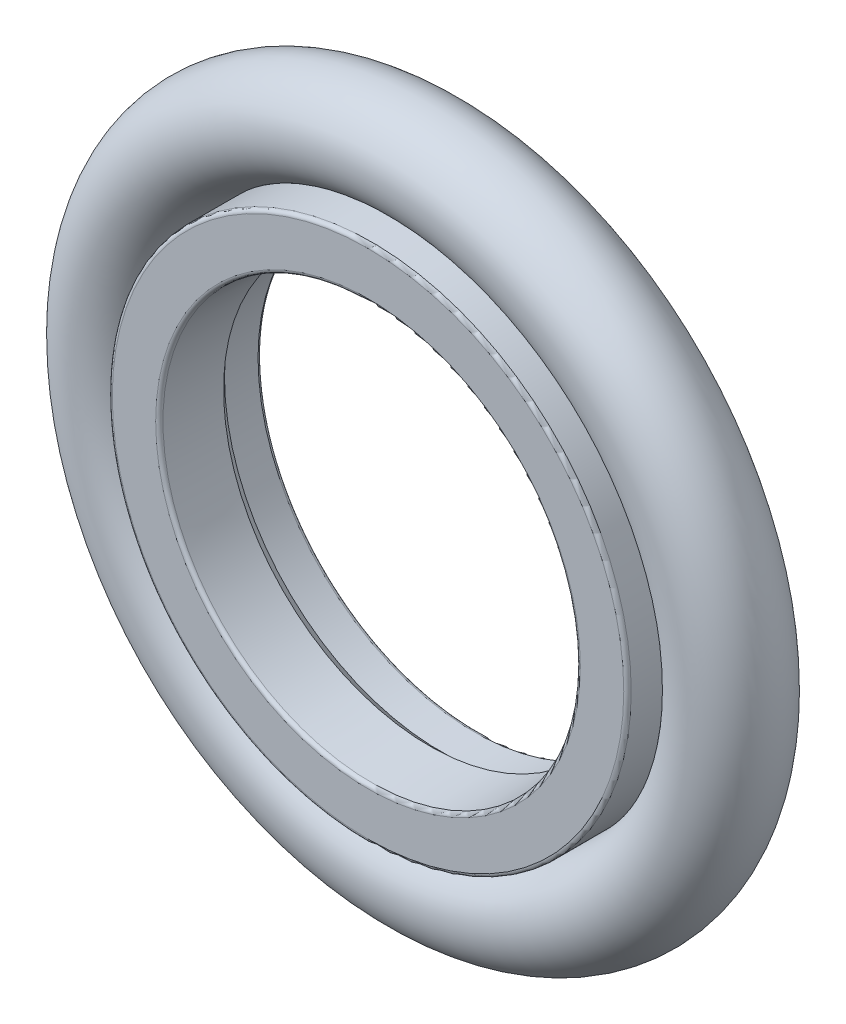
ISO-10303-21;
HEADER;
FILE_DESCRIPTION(('STEP AP214'),'2;1');
FILE_NAME('part.step','',(''),(''),'','','');
FILE_SCHEMA(('AUTOMOTIVE_DESIGN { 1 0 10303 214 1 1 1 1 }'));
ENDSEC;
DATA;
#1=APPLICATION_CONTEXT('core data for automotive mechanical design processes');
#2=APPLICATION_PROTOCOL_DEFINITION('international standard','automotive_design',2000,#1);
#3=PRODUCT_CONTEXT('',#1,'mechanical');
#4=PRODUCT('Part','Part','',(#3));
#5=PRODUCT_RELATED_PRODUCT_CATEGORY('part','',(#4));
#6=PRODUCT_DEFINITION_FORMATION('','',#4);
#7=PRODUCT_DEFINITION_CONTEXT('part definition',#1,'design');
#8=PRODUCT_DEFINITION('design','',#6,#7);
#9=PRODUCT_DEFINITION_SHAPE('','',#8);
#10=(LENGTH_UNIT() NAMED_UNIT(*) SI_UNIT(.MILLI.,.METRE.));
#11=(NAMED_UNIT(*) PLANE_ANGLE_UNIT() SI_UNIT($,.RADIAN.));
#12=(NAMED_UNIT(*) SI_UNIT($,.STERADIAN.) SOLID_ANGLE_UNIT());
#13=UNCERTAINTY_MEASURE_WITH_UNIT(LENGTH_MEASURE(1.E-05),#10,'distance_accuracy_value','');
#14=(GEOMETRIC_REPRESENTATION_CONTEXT(3) GLOBAL_UNCERTAINTY_ASSIGNED_CONTEXT((#13)) GLOBAL_UNIT_ASSIGNED_CONTEXT((#10,
#11,#12)) REPRESENTATION_CONTEXT('',''));
#15=CARTESIAN_POINT('',(0.,0.,0.));
#16=DIRECTION('',(0.,0.,1.));
#17=DIRECTION('',(1.,0.,0.));
#18=AXIS2_PLACEMENT_3D('',#15,#16,#17);
#19=CARTESIAN_POINT('',(0.,0.,-1.475));
#20=DIRECTION('',(0.,0.,1.));
#21=DIRECTION('',(1.,0.,0.));
#22=AXIS2_PLACEMENT_3D('',#19,#20,#21);
#23=TOROIDAL_SURFACE('',#22,8.26,1.3);
#24=CARTESIAN_POINT('',(9.56,0.,-1.475));
#25=VERTEX_POINT('',#24);
#26=VERTEX_LOOP('',#25);
#27=FACE_BOUND('',#26,.T.);
#28=ADVANCED_FACE('F49',(#27),#23,.T.);
#29=CLOSED_SHELL('',(#28));
#30=MANIFOLD_SOLID_BREP('B2',#29);
#31=CARTESIAN_POINT('',(0.,0.,-0.1));
#32=DIRECTION('',(0.,0.,1.));
#33=DIRECTION('',(1.,0.,0.));
#34=AXIS2_PLACEMENT_3D('',#31,#32,#33);
#35=TOROIDAL_SURFACE('',#34,5.6955577979343,0.0999999999999999);
#36=CARTESIAN_POINT('',(0.,0.,-0.0954592339081353));
#37=DIRECTION('',(0.,0.,1.));
#38=DIRECTION('',(1.,0.,0.));
#39=AXIS2_PLACEMENT_3D('',#36,#37,#38);
#40=CIRCLE('',#39,5.59566094391327);
#41=CARTESIAN_POINT('',(5.59566094391327,0.,-0.0954592339081353));
#42=VERTEX_POINT('',#41);
#43=EDGE_CURVE('E48',#42,#42,#40,.T.);
#44=ORIENTED_EDGE('',*,*,#43,.F.);
#45=EDGE_LOOP('',(#44));
#46=FACE_BOUND('',#45,.T.);
#47=CARTESIAN_POINT('',(0.,0.,0.));
#48=DIRECTION('',(0.,0.,1.));
#49=DIRECTION('',(1.,0.,0.));
#50=AXIS2_PLACEMENT_3D('',#47,#48,#49);
#51=CIRCLE('',#50,5.6955577979343);
#52=CARTESIAN_POINT('',(5.6955577979343,0.,0.));
#53=VERTEX_POINT('',#52);
#54=EDGE_CURVE('E100',#53,#53,#51,.T.);
#55=ORIENTED_EDGE('',*,*,#54,.T.);
#56=EDGE_LOOP('',(#55));
#57=FACE_BOUND('',#56,.T.);
#58=ADVANCED_FACE('F66',(#46,#57),#35,.T.);
#59=CARTESIAN_POINT('',(0.,0.,-0.0954592339081353));
#60=DIRECTION('',(0.,0.,1.));
#61=DIRECTION('',(1.,0.,0.));
#62=AXIS2_PLACEMENT_3D('',#59,#60,#61);
#63=CONICAL_SURFACE('',#62,5.59566094391327,0.0454232794215768);
#64=CARTESIAN_POINT('',(0.,0.,-1.65));
#65=DIRECTION('',(0.,0.,1.));
#66=DIRECTION('',(1.,0.,0.));
#67=AXIS2_PLACEMENT_3D('',#64,#65,#66);
#68=CIRCLE('',#67,5.525);
#69=CARTESIAN_POINT('',(5.525,0.,-1.65));
#70=VERTEX_POINT('',#69);
#71=EDGE_CURVE('E72',#70,#70,#68,.T.);
#72=ORIENTED_EDGE('',*,*,#71,.F.);
#73=EDGE_LOOP('',(#72));
#74=FACE_BOUND('',#73,.T.);
#75=ORIENTED_EDGE('',*,*,#43,.T.);
#76=EDGE_LOOP('',(#75));
#77=FACE_BOUND('',#76,.T.);
#78=ADVANCED_FACE('F149',(#74,#77),#63,.F.);
#79=CARTESIAN_POINT('',(0.,0.,-1.65));
#80=DIRECTION('',(0.,0.,-1.));
#81=DIRECTION('',(-1.,0.,0.));
#82=AXIS2_PLACEMENT_3D('',#79,#80,#81);
#83=CONICAL_SURFACE('',#82,5.525,0.741947268005916);
#84=CARTESIAN_POINT('',(0.,0.,-1.95));
#85=DIRECTION('',(0.,0.,1.));
#86=DIRECTION('',(1.,0.,0.));
#87=AXIS2_PLACEMENT_3D('',#84,#85,#86);
#88=CIRCLE('',#87,5.8);
#89=CARTESIAN_POINT('',(5.8,0.,-1.95));
#90=VERTEX_POINT('',#89);
#91=EDGE_CURVE('E76',#90,#90,#88,.T.);
#92=ORIENTED_EDGE('',*,*,#91,.F.);
#93=EDGE_LOOP('',(#92));
#94=FACE_BOUND('',#93,.T.);
#95=ORIENTED_EDGE('',*,*,#71,.T.);
#96=EDGE_LOOP('',(#95));
#97=FACE_BOUND('',#96,.T.);
#98=ADVANCED_FACE('F144',(#94,#97),#83,.F.);
#99=CARTESIAN_POINT('',(0.,0.,0.));
#100=DIRECTION('',(0.,0.,1.));
#101=DIRECTION('',(1.,0.,0.));
#102=AXIS2_PLACEMENT_3D('',#99,#100,#101);
#103=CYLINDRICAL_SURFACE('',#102,5.8);
#104=CARTESIAN_POINT('',(0.,0.,-2.85));
#105=DIRECTION('',(0.,0.,1.));
#106=DIRECTION('',(1.,0.,0.));
#107=AXIS2_PLACEMENT_3D('',#104,#105,#106);
#108=CIRCLE('',#107,5.8);
#109=CARTESIAN_POINT('',(5.8,0.,-2.85));
#110=VERTEX_POINT('',#109);
#111=EDGE_CURVE('E80',#110,#110,#108,.T.);
#112=ORIENTED_EDGE('',*,*,#111,.F.);
#113=EDGE_LOOP('',(#112));
#114=FACE_BOUND('',#113,.T.);
#115=ORIENTED_EDGE('',*,*,#91,.T.);
#116=EDGE_LOOP('',(#115));
#117=FACE_BOUND('',#116,.T.);
#118=ADVANCED_FACE('F138',(#114,#117),#103,.F.);
#119=CARTESIAN_POINT('',(0.,0.,-2.85));
#120=DIRECTION('',(0.,0.,1.));
#121=DIRECTION('',(1.,0.,0.));
#122=AXIS2_PLACEMENT_3D('',#119,#120,#121);
#123=TOROIDAL_SURFACE('',#122,5.9,0.0999999999999998);
#124=CARTESIAN_POINT('',(0.,0.,-2.95));
#125=DIRECTION('',(0.,0.,1.));
#126=DIRECTION('',(1.,0.,0.));
#127=AXIS2_PLACEMENT_3D('',#124,#125,#126);
#128=CIRCLE('',#127,5.9);
#129=CARTESIAN_POINT('',(5.9,0.,-2.95));
#130=VERTEX_POINT('',#129);
#131=EDGE_CURVE('E85',#130,#130,#128,.T.);
#132=ORIENTED_EDGE('',*,*,#131,.F.);
#133=EDGE_LOOP('',(#132));
#134=FACE_BOUND('',#133,.T.);
#135=ORIENTED_EDGE('',*,*,#111,.T.);
#136=EDGE_LOOP('',(#135));
#137=FACE_BOUND('',#136,.T.);
#138=ADVANCED_FACE('F132',(#134,#137),#123,.T.);
#139=CARTESIAN_POINT('',(0.,6.86,-2.95));
#140=DIRECTION('',(0.,0.,1.));
#141=DIRECTION('',(1.,0.,0.));
#142=AXIS2_PLACEMENT_3D('',#139,#140,#141);
#143=PLANE('',#142);
#144=CARTESIAN_POINT('',(0.,0.,-2.95));
#145=DIRECTION('',(0.,0.,1.));
#146=DIRECTION('',(1.,0.,0.));
#147=AXIS2_PLACEMENT_3D('',#144,#145,#146);
#148=CIRCLE('',#147,6.86);
#149=CARTESIAN_POINT('',(6.86,0.,-2.95));
#150=VERTEX_POINT('',#149);
#151=EDGE_CURVE('E88',#150,#150,#148,.T.);
#152=ORIENTED_EDGE('',*,*,#151,.F.);
#153=EDGE_LOOP('',(#152));
#154=FACE_BOUND('',#153,.T.);
#155=ORIENTED_EDGE('',*,*,#131,.T.);
#156=EDGE_LOOP('',(#155));
#157=FACE_BOUND('',#156,.T.);
#158=ADVANCED_FACE('F126',(#154,#157),#143,.F.);
#159=CARTESIAN_POINT('',(0.,0.,-2.85));
#160=DIRECTION('',(0.,0.,1.));
#161=DIRECTION('',(1.,0.,0.));
#162=AXIS2_PLACEMENT_3D('',#159,#160,#161);
#163=TOROIDAL_SURFACE('',#162,6.86,0.1);
#164=CARTESIAN_POINT('',(0.,0.,-2.85));
#165=DIRECTION('',(0.,0.,1.));
#166=DIRECTION('',(1.,0.,0.));
#167=AXIS2_PLACEMENT_3D('',#164,#165,#166);
#168=CIRCLE('',#167,6.96);
#169=CARTESIAN_POINT('',(6.96,0.,-2.85));
#170=VERTEX_POINT('',#169);
#171=EDGE_CURVE('E91',#170,#170,#168,.T.);
#172=ORIENTED_EDGE('',*,*,#171,.F.);
#173=EDGE_LOOP('',(#172));
#174=FACE_BOUND('',#173,.T.);
#175=ORIENTED_EDGE('',*,*,#151,.T.);
#176=EDGE_LOOP('',(#175));
#177=FACE_BOUND('',#176,.T.);
#178=ADVANCED_FACE('F120',(#174,#177),#163,.T.);
#179=CARTESIAN_POINT('',(0.,0.,0.));
#180=DIRECTION('',(0.,0.,1.));
#181=DIRECTION('',(1.,0.,0.));
#182=AXIS2_PLACEMENT_3D('',#179,#180,#181);
#183=CYLINDRICAL_SURFACE('',#182,6.96);
#184=CARTESIAN_POINT('',(0.,0.,-0.1));
#185=DIRECTION('',(0.,0.,1.));
#186=DIRECTION('',(1.,0.,0.));
#187=AXIS2_PLACEMENT_3D('',#184,#185,#186);
#188=CIRCLE('',#187,6.96);
#189=CARTESIAN_POINT('',(6.96,0.,-0.1));
#190=VERTEX_POINT('',#189);
#191=EDGE_CURVE('E94',#190,#190,#188,.T.);
#192=ORIENTED_EDGE('',*,*,#191,.F.);
#193=EDGE_LOOP('',(#192));
#194=FACE_BOUND('',#193,.T.);
#195=ORIENTED_EDGE('',*,*,#171,.T.);
#196=EDGE_LOOP('',(#195));
#197=FACE_BOUND('',#196,.T.);
#198=ADVANCED_FACE('F114',(#194,#197),#183,.T.);
#199=CARTESIAN_POINT('',(0.,0.,-0.1));
#200=DIRECTION('',(0.,0.,1.));
#201=DIRECTION('',(1.,0.,0.));
#202=AXIS2_PLACEMENT_3D('',#199,#200,#201);
#203=TOROIDAL_SURFACE('',#202,6.86,0.100000000000001);
#204=CARTESIAN_POINT('',(0.,0.,0.));
#205=DIRECTION('',(0.,0.,1.));
#206=DIRECTION('',(1.,0.,0.));
#207=AXIS2_PLACEMENT_3D('',#204,#205,#206);
#208=CIRCLE('',#207,6.86);
#209=CARTESIAN_POINT('',(6.86,0.,0.));
#210=VERTEX_POINT('',#209);
#211=EDGE_CURVE('E97',#210,#210,#208,.T.);
#212=ORIENTED_EDGE('',*,*,#211,.F.);
#213=EDGE_LOOP('',(#212));
#214=FACE_BOUND('',#213,.T.);
#215=ORIENTED_EDGE('',*,*,#191,.T.);
#216=EDGE_LOOP('',(#215));
#217=FACE_BOUND('',#216,.T.);
#218=ADVANCED_FACE('F108',(#214,#217),#203,.T.);
#219=CARTESIAN_POINT('',(0.,6.86,0.));
#220=DIRECTION('',(0.,0.,-1.));
#221=DIRECTION('',(-1.,0.,0.));
#222=AXIS2_PLACEMENT_3D('',#219,#220,#221);
#223=PLANE('',#222);
#224=ORIENTED_EDGE('',*,*,#54,.F.);
#225=EDGE_LOOP('',(#224));
#226=FACE_BOUND('',#225,.T.);
#227=ORIENTED_EDGE('',*,*,#211,.T.);
#228=EDGE_LOOP('',(#227));
#229=FACE_BOUND('',#228,.T.);
#230=ADVANCED_FACE('F105',(#226,#229),#223,.F.);
#231=CLOSED_SHELL('',(#58,#78,#98,#118,#138,#158,#178,#198,#218,#230));
#232=MANIFOLD_SOLID_BREP('B6',#231);
#233=ADVANCED_BREP_SHAPE_REPRESENTATION('',(#18,#30,#232),#14);
#234=SHAPE_DEFINITION_REPRESENTATION(#9,#233);
ENDSEC;
END-ISO-10303-21;
